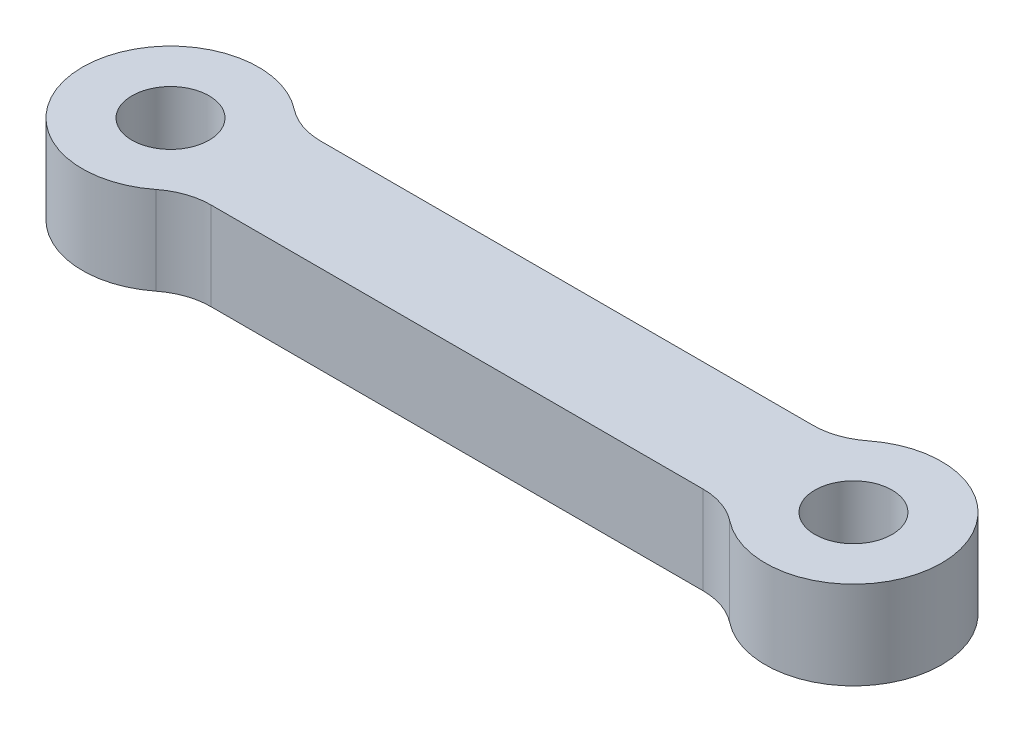
ISO-10303-21;
HEADER;
FILE_DESCRIPTION(('STEP AP214'),'2;1');
FILE_NAME('part.step','',(''),(''),'','','');
FILE_SCHEMA(('AUTOMOTIVE_DESIGN { 1 0 10303 214 1 1 1 1 }'));
ENDSEC;
DATA;
#1=APPLICATION_CONTEXT('core data for automotive mechanical design processes');
#2=APPLICATION_PROTOCOL_DEFINITION('international standard','automotive_design',2000,#1);
#3=PRODUCT_CONTEXT('',#1,'mechanical');
#4=PRODUCT('Part','Part','',(#3));
#5=PRODUCT_RELATED_PRODUCT_CATEGORY('part','',(#4));
#6=PRODUCT_DEFINITION_FORMATION('','',#4);
#7=PRODUCT_DEFINITION_CONTEXT('part definition',#1,'design');
#8=PRODUCT_DEFINITION('design','',#6,#7);
#9=PRODUCT_DEFINITION_SHAPE('','',#8);
#10=(LENGTH_UNIT() NAMED_UNIT(*) SI_UNIT(.MILLI.,.METRE.));
#11=(NAMED_UNIT(*) PLANE_ANGLE_UNIT() SI_UNIT($,.RADIAN.));
#12=(NAMED_UNIT(*) SI_UNIT($,.STERADIAN.) SOLID_ANGLE_UNIT());
#13=UNCERTAINTY_MEASURE_WITH_UNIT(LENGTH_MEASURE(1.E-05),#10,'distance_accuracy_value','');
#14=(GEOMETRIC_REPRESENTATION_CONTEXT(3) GLOBAL_UNCERTAINTY_ASSIGNED_CONTEXT((#13)) GLOBAL_UNIT_ASSIGNED_CONTEXT((#10,
#11,#12)) REPRESENTATION_CONTEXT('',''));
#15=CARTESIAN_POINT('',(0.,0.,0.));
#16=DIRECTION('',(0.,0.,1.));
#17=DIRECTION('',(1.,0.,0.));
#18=AXIS2_PLACEMENT_3D('',#15,#16,#17);
#19=CARTESIAN_POINT('',(31.,4.,0.));
#20=DIRECTION('',(0.,-1.,0.));
#21=DIRECTION('',(0.,0.,-1.));
#22=AXIS2_PLACEMENT_3D('',#19,#20,#21);
#23=CYLINDRICAL_SURFACE('',#22,4.00000000000001);
#24=CARTESIAN_POINT('',(31.,0.,0.));
#25=DIRECTION('',(0.,1.,0.));
#26=DIRECTION('',(0.,0.,1.));
#27=AXIS2_PLACEMENT_3D('',#24,#25,#26);
#28=CIRCLE('',#27,4.00000000000001);
#29=CARTESIAN_POINT('',(28.525641703473,0.,3.14285714285714));
#30=VERTEX_POINT('',#29);
#31=CARTESIAN_POINT('',(28.525641703473,0.,-3.14285714285714));
#32=VERTEX_POINT('',#31);
#33=EDGE_CURVE('E137',#30,#32,#28,.T.);
#34=ORIENTED_EDGE('',*,*,#33,.T.);
#35=DIRECTION('',(0.,-1.,0.));
#36=VECTOR('',#35,1.);
#37=CARTESIAN_POINT('',(28.525641703473,4.,-3.14285714285714));
#38=LINE('',#37,#36);
#39=CARTESIAN_POINT('',(28.525641703473,4.,-3.14285714285714));
#40=VERTEX_POINT('',#39);
#41=EDGE_CURVE('E158',#32,#40,#38,.F.);
#42=ORIENTED_EDGE('',*,*,#41,.T.);
#43=CARTESIAN_POINT('',(31.,4.,0.));
#44=DIRECTION('',(0.,1.,0.));
#45=DIRECTION('',(0.,0.,1.));
#46=AXIS2_PLACEMENT_3D('',#43,#44,#45);
#47=CIRCLE('',#46,4.00000000000001);
#48=CARTESIAN_POINT('',(28.525641703473,4.,3.14285714285714));
#49=VERTEX_POINT('',#48);
#50=EDGE_CURVE('E200',#49,#40,#47,.T.);
#51=ORIENTED_EDGE('',*,*,#50,.F.);
#52=DIRECTION('',(0.,-1.,0.));
#53=VECTOR('',#52,1.);
#54=CARTESIAN_POINT('',(28.525641703473,4.,3.14285714285714));
#55=LINE('',#54,#53);
#56=EDGE_CURVE('E146',#49,#30,#55,.T.);
#57=ORIENTED_EDGE('',*,*,#56,.T.);
#58=EDGE_LOOP('',(#34,#42,#51,#57));
#59=FACE_BOUND('',#58,.T.);
#60=ADVANCED_FACE('F45',(#59),#23,.T.);
#61=CARTESIAN_POINT('',(0.,4.,-2.5));
#62=DIRECTION('',(0.,0.,-1.));
#63=DIRECTION('',(-1.,0.,0.));
#64=AXIS2_PLACEMENT_3D('',#61,#62,#63);
#65=PLANE('',#64);
#66=DIRECTION('',(1.,0.,0.));
#67=VECTOR('',#66,1.);
#68=CARTESIAN_POINT('',(0.,4.,-2.5));
#69=LINE('',#68,#67);
#70=CARTESIAN_POINT('',(4.33012701892219,4.,-2.5));
#71=VERTEX_POINT('',#70);
#72=CARTESIAN_POINT('',(26.6698729810778,4.,-2.5));
#73=VERTEX_POINT('',#72);
#74=EDGE_CURVE('E206',#71,#73,#69,.T.);
#75=ORIENTED_EDGE('',*,*,#74,.T.);
#76=DIRECTION('',(0.,-1.,0.));
#77=VECTOR('',#76,1.);
#78=CARTESIAN_POINT('',(26.6698729810778,4.,-2.5));
#79=LINE('',#78,#77);
#80=CARTESIAN_POINT('',(26.6698729810778,0.,-2.5));
#81=VERTEX_POINT('',#80);
#82=EDGE_CURVE('E135',#73,#81,#79,.T.);
#83=ORIENTED_EDGE('',*,*,#82,.T.);
#84=DIRECTION('',(1.,0.,0.));
#85=VECTOR('',#84,1.);
#86=CARTESIAN_POINT('',(0.,0.,-2.5));
#87=LINE('',#86,#85);
#88=CARTESIAN_POINT('',(4.33012701892219,0.,-2.5));
#89=VERTEX_POINT('',#88);
#90=EDGE_CURVE('E117',#89,#81,#87,.T.);
#91=ORIENTED_EDGE('',*,*,#90,.F.);
#92=DIRECTION('',(0.,-1.,0.));
#93=VECTOR('',#92,1.);
#94=CARTESIAN_POINT('',(4.33012701892219,4.,-2.5));
#95=LINE('',#94,#93);
#96=EDGE_CURVE('E132',#89,#71,#95,.F.);
#97=ORIENTED_EDGE('',*,*,#96,.T.);
#98=EDGE_LOOP('',(#75,#83,#91,#97));
#99=FACE_BOUND('',#98,.T.);
#100=ADVANCED_FACE('F131',(#99),#65,.T.);
#101=CARTESIAN_POINT('',(0.,4.,0.));
#102=DIRECTION('',(0.,-1.,0.));
#103=DIRECTION('',(0.,0.,-1.));
#104=AXIS2_PLACEMENT_3D('',#101,#102,#103);
#105=CYLINDRICAL_SURFACE('',#104,4.);
#106=CARTESIAN_POINT('',(0.,4.,0.));
#107=DIRECTION('',(0.,1.,0.));
#108=DIRECTION('',(0.,0.,1.));
#109=AXIS2_PLACEMENT_3D('',#106,#107,#108);
#110=CIRCLE('',#109,4.);
#111=CARTESIAN_POINT('',(2.47435829652697,4.,-3.14285714285714));
#112=VERTEX_POINT('',#111);
#113=CARTESIAN_POINT('',(2.47435829652697,4.,3.14285714285714));
#114=VERTEX_POINT('',#113);
#115=EDGE_CURVE('E210',#112,#114,#110,.T.);
#116=ORIENTED_EDGE('',*,*,#115,.F.);
#117=DIRECTION('',(0.,-1.,0.));
#118=VECTOR('',#117,1.);
#119=CARTESIAN_POINT('',(2.47435829652697,4.,-3.14285714285714));
#120=LINE('',#119,#118);
#121=CARTESIAN_POINT('',(2.47435829652697,0.,-3.14285714285714));
#122=VERTEX_POINT('',#121);
#123=EDGE_CURVE('E164',#112,#122,#120,.T.);
#124=ORIENTED_EDGE('',*,*,#123,.T.);
#125=CARTESIAN_POINT('',(0.,0.,0.));
#126=DIRECTION('',(0.,1.,0.));
#127=DIRECTION('',(0.,0.,1.));
#128=AXIS2_PLACEMENT_3D('',#125,#126,#127);
#129=CIRCLE('',#128,4.);
#130=CARTESIAN_POINT('',(2.47435829652697,0.,3.14285714285714));
#131=VERTEX_POINT('',#130);
#132=EDGE_CURVE('E119',#122,#131,#129,.T.);
#133=ORIENTED_EDGE('',*,*,#132,.T.);
#134=DIRECTION('',(0.,-1.,0.));
#135=VECTOR('',#134,1.);
#136=CARTESIAN_POINT('',(2.47435829652697,4.,3.14285714285714));
#137=LINE('',#136,#135);
#138=EDGE_CURVE('E161',#131,#114,#137,.F.);
#139=ORIENTED_EDGE('',*,*,#138,.T.);
#140=EDGE_LOOP('',(#116,#124,#133,#139));
#141=FACE_BOUND('',#140,.T.);
#142=ADVANCED_FACE('F231',(#141),#105,.T.);
#143=CARTESIAN_POINT('',(0.,4.,0.));
#144=DIRECTION('',(0.,-1.,0.));
#145=DIRECTION('',(0.,0.,-1.));
#146=AXIS2_PLACEMENT_3D('',#143,#144,#145);
#147=CYLINDRICAL_SURFACE('',#146,1.75);
#148=CARTESIAN_POINT('',(0.,4.,0.));
#149=DIRECTION('',(0.,1.,0.));
#150=DIRECTION('',(0.,0.,1.));
#151=AXIS2_PLACEMENT_3D('',#148,#149,#150);
#152=CIRCLE('',#151,1.75);
#153=CARTESIAN_POINT('',(0.,4.,1.75));
#154=VERTEX_POINT('',#153);
#155=EDGE_CURVE('E149',#154,#154,#152,.T.);
#156=ORIENTED_EDGE('',*,*,#155,.T.);
#157=EDGE_LOOP('',(#156));
#158=FACE_BOUND('',#157,.T.);
#159=CARTESIAN_POINT('',(0.,0.,0.));
#160=DIRECTION('',(0.,1.,0.));
#161=DIRECTION('',(0.,0.,1.));
#162=AXIS2_PLACEMENT_3D('',#159,#160,#161);
#163=CIRCLE('',#162,1.75);
#164=CARTESIAN_POINT('',(0.,0.,1.75));
#165=VERTEX_POINT('',#164);
#166=EDGE_CURVE('E193',#165,#165,#163,.T.);
#167=ORIENTED_EDGE('',*,*,#166,.F.);
#168=EDGE_LOOP('',(#167));
#169=FACE_BOUND('',#168,.T.);
#170=ADVANCED_FACE('F229',(#158,#169),#147,.F.);
#171=CARTESIAN_POINT('',(0.,4.,2.5));
#172=DIRECTION('',(0.,0.,-1.));
#173=DIRECTION('',(-1.,0.,0.));
#174=AXIS2_PLACEMENT_3D('',#171,#172,#173);
#175=PLANE('',#174);
#176=DIRECTION('',(1.,0.,0.));
#177=VECTOR('',#176,1.);
#178=CARTESIAN_POINT('',(0.,4.,2.5));
#179=LINE('',#178,#177);
#180=CARTESIAN_POINT('',(4.33012701892219,4.,2.5));
#181=VERTEX_POINT('',#180);
#182=CARTESIAN_POINT('',(26.6698729810778,4.,2.5));
#183=VERTEX_POINT('',#182);
#184=EDGE_CURVE('E202',#181,#183,#179,.T.);
#185=ORIENTED_EDGE('',*,*,#184,.F.);
#186=DIRECTION('',(0.,1.,0.));
#187=VECTOR('',#186,1.);
#188=CARTESIAN_POINT('',(4.33012701892219,0.,2.5));
#189=LINE('',#188,#187);
#190=CARTESIAN_POINT('',(4.33012701892219,0.,2.5));
#191=VERTEX_POINT('',#190);
#192=EDGE_CURVE('E169',#181,#191,#189,.F.);
#193=ORIENTED_EDGE('',*,*,#192,.T.);
#194=DIRECTION('',(1.,0.,0.));
#195=VECTOR('',#194,1.);
#196=CARTESIAN_POINT('',(0.,0.,2.5));
#197=LINE('',#196,#195);
#198=CARTESIAN_POINT('',(26.6698729810778,0.,2.5));
#199=VERTEX_POINT('',#198);
#200=EDGE_CURVE('E186',#191,#199,#197,.T.);
#201=ORIENTED_EDGE('',*,*,#200,.T.);
#202=DIRECTION('',(0.,1.,0.));
#203=VECTOR('',#202,1.);
#204=CARTESIAN_POINT('',(26.6698729810778,4.,2.5));
#205=LINE('',#204,#203);
#206=EDGE_CURVE('E61',#199,#183,#205,.T.);
#207=ORIENTED_EDGE('',*,*,#206,.T.);
#208=EDGE_LOOP('',(#185,#193,#201,#207));
#209=FACE_BOUND('',#208,.T.);
#210=ADVANCED_FACE('F190',(#209),#175,.F.);
#211=CARTESIAN_POINT('',(31.,4.,0.));
#212=DIRECTION('',(0.,-1.,0.));
#213=DIRECTION('',(0.,0.,-1.));
#214=AXIS2_PLACEMENT_3D('',#211,#212,#213);
#215=CYLINDRICAL_SURFACE('',#214,1.75);
#216=CARTESIAN_POINT('',(31.,4.,0.));
#217=DIRECTION('',(0.,1.,0.));
#218=DIRECTION('',(0.,0.,1.));
#219=AXIS2_PLACEMENT_3D('',#216,#217,#218);
#220=CIRCLE('',#219,1.75);
#221=CARTESIAN_POINT('',(31.,4.,1.75));
#222=VERTEX_POINT('',#221);
#223=EDGE_CURVE('E142',#222,#222,#220,.T.);
#224=ORIENTED_EDGE('',*,*,#223,.T.);
#225=EDGE_LOOP('',(#224));
#226=FACE_BOUND('',#225,.T.);
#227=CARTESIAN_POINT('',(31.,0.,0.));
#228=DIRECTION('',(0.,1.,0.));
#229=DIRECTION('',(0.,0.,1.));
#230=AXIS2_PLACEMENT_3D('',#227,#228,#229);
#231=CIRCLE('',#230,1.75);
#232=CARTESIAN_POINT('',(31.,0.,1.75));
#233=VERTEX_POINT('',#232);
#234=EDGE_CURVE('E152',#233,#233,#231,.T.);
#235=ORIENTED_EDGE('',*,*,#234,.F.);
#236=EDGE_LOOP('',(#235));
#237=FACE_BOUND('',#236,.T.);
#238=ADVANCED_FACE('F238',(#226,#237),#215,.F.);
#239=CARTESIAN_POINT('',(0.,4.,0.));
#240=DIRECTION('',(0.,1.,0.));
#241=DIRECTION('',(0.,0.,1.));
#242=AXIS2_PLACEMENT_3D('',#239,#240,#241);
#243=PLANE('',#242);
#244=ORIENTED_EDGE('',*,*,#184,.T.);
#245=CARTESIAN_POINT('',(26.6698729810778,4.,5.5));
#246=DIRECTION('',(0.,1.,0.));
#247=DIRECTION('',(0.,0.,1.));
#248=AXIS2_PLACEMENT_3D('',#245,#246,#247);
#249=CIRCLE('',#248,3.);
#250=EDGE_CURVE('E11',#183,#49,#249,.F.);
#251=ORIENTED_EDGE('',*,*,#250,.T.);
#252=ORIENTED_EDGE('',*,*,#50,.T.);
#253=CARTESIAN_POINT('',(26.6698729810778,4.,-5.5));
#254=DIRECTION('',(0.,1.,0.));
#255=DIRECTION('',(0.,0.,1.));
#256=AXIS2_PLACEMENT_3D('',#253,#254,#255);
#257=CIRCLE('',#256,3.);
#258=EDGE_CURVE('E126',#40,#73,#257,.F.);
#259=ORIENTED_EDGE('',*,*,#258,.T.);
#260=ORIENTED_EDGE('',*,*,#74,.F.);
#261=CARTESIAN_POINT('',(4.33012701892219,4.,-5.5));
#262=DIRECTION('',(0.,1.,0.));
#263=DIRECTION('',(0.,0.,1.));
#264=AXIS2_PLACEMENT_3D('',#261,#262,#263);
#265=CIRCLE('',#264,3.);
#266=EDGE_CURVE('E125',#71,#112,#265,.F.);
#267=ORIENTED_EDGE('',*,*,#266,.T.);
#268=ORIENTED_EDGE('',*,*,#115,.T.);
#269=CARTESIAN_POINT('',(4.33012701892219,4.,5.5));
#270=DIRECTION('',(0.,1.,0.));
#271=DIRECTION('',(0.,0.,1.));
#272=AXIS2_PLACEMENT_3D('',#269,#270,#271);
#273=CIRCLE('',#272,3.);
#274=EDGE_CURVE('E68',#114,#181,#273,.F.);
#275=ORIENTED_EDGE('',*,*,#274,.T.);
#276=EDGE_LOOP('',(#244,#251,#252,#259,#260,#267,#268,#275));
#277=FACE_BOUND('',#276,.T.);
#278=ORIENTED_EDGE('',*,*,#155,.F.);
#279=EDGE_LOOP('',(#278));
#280=FACE_BOUND('',#279,.T.);
#281=ORIENTED_EDGE('',*,*,#223,.F.);
#282=EDGE_LOOP('',(#281));
#283=FACE_BOUND('',#282,.T.);
#284=ADVANCED_FACE('F198',(#277,#280,#283),#243,.T.);
#285=CARTESIAN_POINT('',(0.,0.,0.));
#286=DIRECTION('',(0.,1.,0.));
#287=DIRECTION('',(0.,0.,1.));
#288=AXIS2_PLACEMENT_3D('',#285,#286,#287);
#289=PLANE('',#288);
#290=ORIENTED_EDGE('',*,*,#33,.F.);
#291=CARTESIAN_POINT('',(26.6698729810778,0.,5.5));
#292=DIRECTION('',(0.,1.,0.));
#293=DIRECTION('',(0.,0.,1.));
#294=AXIS2_PLACEMENT_3D('',#291,#292,#293);
#295=CIRCLE('',#294,3.);
#296=EDGE_CURVE('E54',#30,#199,#295,.T.);
#297=ORIENTED_EDGE('',*,*,#296,.T.);
#298=ORIENTED_EDGE('',*,*,#200,.F.);
#299=CARTESIAN_POINT('',(4.33012701892219,0.,5.5));
#300=DIRECTION('',(0.,1.,0.));
#301=DIRECTION('',(0.,0.,1.));
#302=AXIS2_PLACEMENT_3D('',#299,#300,#301);
#303=CIRCLE('',#302,3.);
#304=EDGE_CURVE('E180',#191,#131,#303,.T.);
#305=ORIENTED_EDGE('',*,*,#304,.T.);
#306=ORIENTED_EDGE('',*,*,#132,.F.);
#307=CARTESIAN_POINT('',(4.33012701892219,0.,-5.5));
#308=DIRECTION('',(0.,1.,0.));
#309=DIRECTION('',(0.,0.,1.));
#310=AXIS2_PLACEMENT_3D('',#307,#308,#309);
#311=CIRCLE('',#310,3.);
#312=EDGE_CURVE('E112',#122,#89,#311,.T.);
#313=ORIENTED_EDGE('',*,*,#312,.T.);
#314=ORIENTED_EDGE('',*,*,#90,.T.);
#315=CARTESIAN_POINT('',(26.6698729810778,0.,-5.5));
#316=DIRECTION('',(0.,1.,0.));
#317=DIRECTION('',(0.,0.,1.));
#318=AXIS2_PLACEMENT_3D('',#315,#316,#317);
#319=CIRCLE('',#318,3.);
#320=EDGE_CURVE('E173',#81,#32,#319,.T.);
#321=ORIENTED_EDGE('',*,*,#320,.T.);
#322=EDGE_LOOP('',(#290,#297,#298,#305,#306,#313,#314,#321));
#323=FACE_BOUND('',#322,.T.);
#324=ORIENTED_EDGE('',*,*,#166,.T.);
#325=EDGE_LOOP('',(#324));
#326=FACE_BOUND('',#325,.T.);
#327=ORIENTED_EDGE('',*,*,#234,.T.);
#328=EDGE_LOOP('',(#327));
#329=FACE_BOUND('',#328,.T.);
#330=ADVANCED_FACE('F115',(#323,#326,#329),#289,.F.);
#331=CARTESIAN_POINT('',(26.6698729810778,4.,-5.5));
#332=DIRECTION('',(0.,-1.,0.));
#333=DIRECTION('',(0.,0.,-1.));
#334=AXIS2_PLACEMENT_3D('',#331,#332,#333);
#335=CYLINDRICAL_SURFACE('',#334,3.);
#336=ORIENTED_EDGE('',*,*,#258,.F.);
#337=ORIENTED_EDGE('',*,*,#41,.F.);
#338=ORIENTED_EDGE('',*,*,#320,.F.);
#339=ORIENTED_EDGE('',*,*,#82,.F.);
#340=EDGE_LOOP('',(#336,#337,#338,#339));
#341=FACE_BOUND('',#340,.T.);
#342=ADVANCED_FACE('F250',(#341),#335,.F.);
#343=CARTESIAN_POINT('',(4.33012701892219,4.,-5.5));
#344=DIRECTION('',(0.,-1.,0.));
#345=DIRECTION('',(0.,0.,-1.));
#346=AXIS2_PLACEMENT_3D('',#343,#344,#345);
#347=CYLINDRICAL_SURFACE('',#346,3.);
#348=ORIENTED_EDGE('',*,*,#266,.F.);
#349=ORIENTED_EDGE('',*,*,#96,.F.);
#350=ORIENTED_EDGE('',*,*,#312,.F.);
#351=ORIENTED_EDGE('',*,*,#123,.F.);
#352=EDGE_LOOP('',(#348,#349,#350,#351));
#353=FACE_BOUND('',#352,.T.);
#354=ADVANCED_FACE('F140',(#353),#347,.F.);
#355=CARTESIAN_POINT('',(4.33012701892219,4.,5.5));
#356=DIRECTION('',(0.,-1.,0.));
#357=DIRECTION('',(0.,0.,-1.));
#358=AXIS2_PLACEMENT_3D('',#355,#356,#357);
#359=CYLINDRICAL_SURFACE('',#358,3.);
#360=ORIENTED_EDGE('',*,*,#274,.F.);
#361=ORIENTED_EDGE('',*,*,#138,.F.);
#362=ORIENTED_EDGE('',*,*,#304,.F.);
#363=ORIENTED_EDGE('',*,*,#192,.F.);
#364=EDGE_LOOP('',(#360,#361,#362,#363));
#365=FACE_BOUND('',#364,.T.);
#366=ADVANCED_FACE('F255',(#365),#359,.F.);
#367=CARTESIAN_POINT('',(26.6698729810778,4.,5.5));
#368=DIRECTION('',(0.,-1.,0.));
#369=DIRECTION('',(0.,0.,-1.));
#370=AXIS2_PLACEMENT_3D('',#367,#368,#369);
#371=CYLINDRICAL_SURFACE('',#370,3.);
#372=ORIENTED_EDGE('',*,*,#250,.F.);
#373=ORIENTED_EDGE('',*,*,#206,.F.);
#374=ORIENTED_EDGE('',*,*,#296,.F.);
#375=ORIENTED_EDGE('',*,*,#56,.F.);
#376=EDGE_LOOP('',(#372,#373,#374,#375));
#377=FACE_BOUND('',#376,.T.);
#378=ADVANCED_FACE('F47',(#377),#371,.F.);
#379=CLOSED_SHELL('',(#60,#100,#142,#170,#210,#238,#284,#330,#342,#354,#366,#378));
#380=MANIFOLD_SOLID_BREP('B2',#379);
#381=ADVANCED_BREP_SHAPE_REPRESENTATION('',(#18,#380),#14);
#382=SHAPE_DEFINITION_REPRESENTATION(#9,#381);
ENDSEC;
END-ISO-10303-21;
